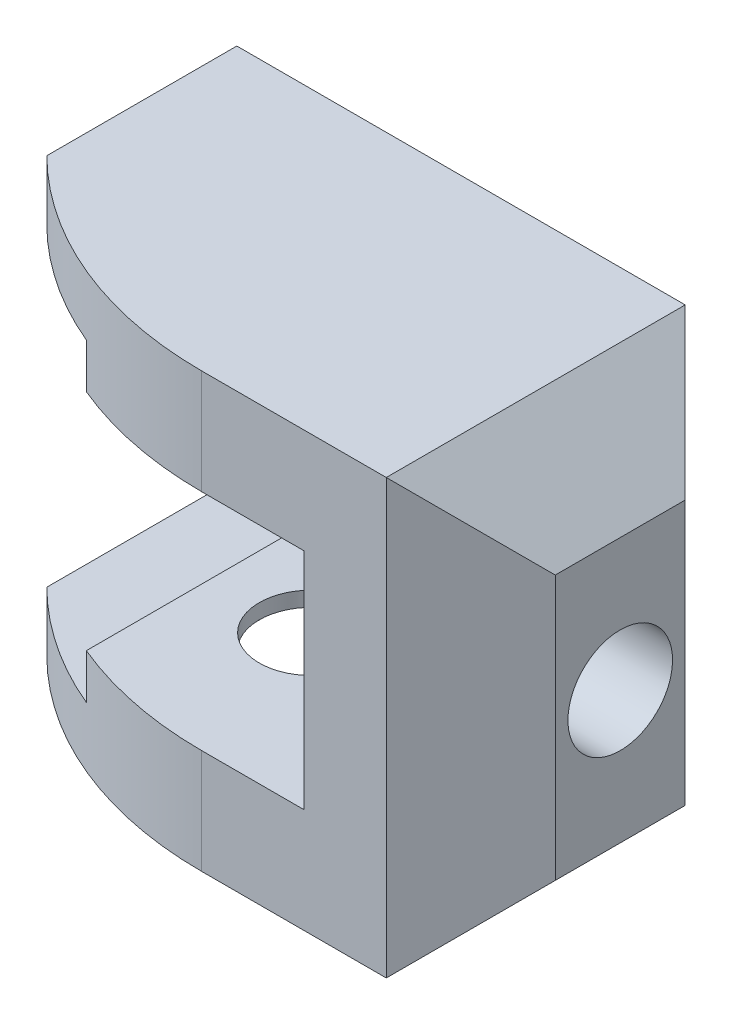
ISO-10303-21;
HEADER;
FILE_DESCRIPTION(('STEP AP214'),'2;1');
FILE_NAME('part.step','',(''),(''),'','','');
FILE_SCHEMA(('AUTOMOTIVE_DESIGN { 1 0 10303 214 1 1 1 1 }'));
ENDSEC;
DATA;
#1=APPLICATION_CONTEXT('core data for automotive mechanical design processes');
#2=APPLICATION_PROTOCOL_DEFINITION('international standard','automotive_design',2000,#1);
#3=PRODUCT_CONTEXT('',#1,'mechanical');
#4=PRODUCT('Part','Part','',(#3));
#5=PRODUCT_RELATED_PRODUCT_CATEGORY('part','',(#4));
#6=PRODUCT_DEFINITION_FORMATION('','',#4);
#7=PRODUCT_DEFINITION_CONTEXT('part definition',#1,'design');
#8=PRODUCT_DEFINITION('design','',#6,#7);
#9=PRODUCT_DEFINITION_SHAPE('','',#8);
#10=(LENGTH_UNIT() NAMED_UNIT(*) SI_UNIT(.MILLI.,.METRE.));
#11=(NAMED_UNIT(*) PLANE_ANGLE_UNIT() SI_UNIT($,.RADIAN.));
#12=(NAMED_UNIT(*) SI_UNIT($,.STERADIAN.) SOLID_ANGLE_UNIT());
#13=UNCERTAINTY_MEASURE_WITH_UNIT(LENGTH_MEASURE(1.E-05),#10,'distance_accuracy_value','');
#14=(GEOMETRIC_REPRESENTATION_CONTEXT(3) GLOBAL_UNCERTAINTY_ASSIGNED_CONTEXT((#13)) GLOBAL_UNIT_ASSIGNED_CONTEXT((#10,
#11,#12)) REPRESENTATION_CONTEXT('',''));
#15=CARTESIAN_POINT('',(0.,0.,0.));
#16=DIRECTION('',(0.,0.,1.));
#17=DIRECTION('',(1.,0.,0.));
#18=AXIS2_PLACEMENT_3D('',#15,#16,#17);
#19=CARTESIAN_POINT('',(29.,58.001,19.));
#20=DIRECTION('',(0.,-1.,0.));
#21=DIRECTION('',(0.,0.,-1.));
#22=AXIS2_PLACEMENT_3D('',#19,#20,#21);
#23=CYLINDRICAL_SURFACE('',#22,7.);
#24=CARTESIAN_POINT('',(29.,14.,19.));
#25=DIRECTION('',(0.,-1.,0.));
#26=DIRECTION('',(1.,0.,0.));
#27=AXIS2_PLACEMENT_3D('',#24,#25,#26);
#28=CIRCLE('',#27,7.);
#29=CARTESIAN_POINT('',(36.,14.,19.));
#30=VERTEX_POINT('',#29);
#31=EDGE_CURVE('E292',#30,#30,#28,.F.);
#32=ORIENTED_EDGE('',*,*,#31,.T.);
#33=EDGE_LOOP('',(#32));
#34=FACE_BOUND('',#33,.T.);
#35=CARTESIAN_POINT('',(29.,12.,19.));
#36=DIRECTION('',(0.,-1.,0.));
#37=DIRECTION('',(0.,0.,-1.));
#38=AXIS2_PLACEMENT_3D('',#35,#36,#37);
#39=CIRCLE('',#38,7.);
#40=CARTESIAN_POINT('',(29.,12.,12.));
#41=VERTEX_POINT('',#40);
#42=EDGE_CURVE('E49',#41,#41,#39,.F.);
#43=ORIENTED_EDGE('',*,*,#42,.F.);
#44=EDGE_LOOP('',(#43));
#45=FACE_BOUND('',#44,.T.);
#46=ADVANCED_FACE('F45',(#34,#45),#23,.F.);
#47=CARTESIAN_POINT('',(35.2836459108254,6.,-10.));
#48=DIRECTION('',(0.,-1.,0.));
#49=DIRECTION('',(0.,0.,-1.));
#50=AXIS2_PLACEMENT_3D('',#47,#48,#49);
#51=PLANE('',#50);
#52=DIRECTION('',(0.,0.,-1.));
#53=VECTOR('',#52,1.);
#54=CARTESIAN_POINT('',(16.0232836718898,6.,2.));
#55=LINE('',#54,#53);
#56=CARTESIAN_POINT('',(16.0232836718898,6.,33.9663331018744));
#57=VERTEX_POINT('',#56);
#58=CARTESIAN_POINT('',(16.0232836718898,6.,2.));
#59=VERTEX_POINT('',#58);
#60=EDGE_CURVE('E62',#57,#59,#55,.T.);
#61=ORIENTED_EDGE('',*,*,#60,.F.);
#62=CARTESIAN_POINT('',(35.2836459108254,6.,-10.));
#63=DIRECTION('',(0.,-1.,0.));
#64=DIRECTION('',(0.,0.,-1.));
#65=AXIS2_PLACEMENT_3D('',#62,#63,#64);
#66=CIRCLE('',#65,48.);
#67=CARTESIAN_POINT('',(0.,6.,22.5432686010409));
#68=VERTEX_POINT('',#67);
#69=EDGE_CURVE('E261',#57,#68,#66,.T.);
#70=ORIENTED_EDGE('',*,*,#69,.T.);
#71=DIRECTION('',(0.,0.,-1.));
#72=VECTOR('',#71,1.);
#73=CARTESIAN_POINT('',(0.,6.,22.5432686010409));
#74=LINE('',#73,#72);
#75=CARTESIAN_POINT('',(0.,6.,2.));
#76=VERTEX_POINT('',#75);
#77=EDGE_CURVE('E260',#68,#76,#74,.T.);
#78=ORIENTED_EDGE('',*,*,#77,.T.);
#79=DIRECTION('',(1.,0.,0.));
#80=VECTOR('',#79,1.);
#81=CARTESIAN_POINT('',(0.,6.,2.));
#82=LINE('',#81,#80);
#83=EDGE_CURVE('E264',#76,#59,#82,.T.);
#84=ORIENTED_EDGE('',*,*,#83,.T.);
#85=EDGE_LOOP('',(#61,#70,#78,#84));
#86=FACE_BOUND('',#85,.T.);
#87=ADVANCED_FACE('F453',(#86),#51,.T.);
#88=CARTESIAN_POINT('',(71.3057054763988,11.3057054763986,40.));
#89=DIRECTION('',(-0.707106781186544,0.707106781186551,0.));
#90=DIRECTION('',(-0.707106781186551,-0.707106781186544,0.));
#91=AXIS2_PLACEMENT_3D('',#88,#89,#90);
#92=PLANE('',#91);
#93=DIRECTION('',(-0.577350269189633,-0.577350269189627,-0.577350269189618));
#94=VECTOR('',#93,1.);
#95=CARTESIAN_POINT('',(80.8704703175993,20.870470317599,20.8704703175987));
#96=LINE('',#95,#94);
#97=CARTESIAN_POINT('',(71.3057054763988,11.3057054763987,11.3057054763985));
#98=VERTEX_POINT('',#97);
#99=CARTESIAN_POINT('',(60.,0.,0.));
#100=VERTEX_POINT('',#99);
#101=EDGE_CURVE('E313',#98,#100,#96,.T.);
#102=ORIENTED_EDGE('',*,*,#101,.F.);
#103=DIRECTION('',(0.,0.,-1.));
#104=VECTOR('',#103,1.);
#105=CARTESIAN_POINT('',(71.3057054763988,11.3057054763986,40.));
#106=LINE('',#105,#104);
#107=CARTESIAN_POINT('',(71.3057054763988,11.3057054763987,28.694294523601));
#108=VERTEX_POINT('',#107);
#109=EDGE_CURVE('E418',#108,#98,#106,.T.);
#110=ORIENTED_EDGE('',*,*,#109,.F.);
#111=DIRECTION('',(0.577350269189623,0.577350269189617,-0.577350269189638));
#112=VECTOR('',#111,1.);
#113=CARTESIAN_POINT('',(67.5371369842657,7.53713698426561,32.4628630157341));
#114=LINE('',#113,#112);
#115=CARTESIAN_POINT('',(60.,0.,40.));
#116=VERTEX_POINT('',#115);
#117=EDGE_CURVE('E317',#116,#108,#114,.T.);
#118=ORIENTED_EDGE('',*,*,#117,.F.);
#119=DIRECTION('',(0.,0.,-1.));
#120=VECTOR('',#119,1.);
#121=CARTESIAN_POINT('',(60.,0.,40.));
#122=LINE('',#121,#120);
#123=EDGE_CURVE('E421',#116,#100,#122,.T.);
#124=ORIENTED_EDGE('',*,*,#123,.T.);
#125=EDGE_LOOP('',(#102,#110,#118,#124));
#126=FACE_BOUND('',#125,.T.);
#127=ADVANCED_FACE('F460',(#126),#92,.F.);
#128=CARTESIAN_POINT('',(71.3057054763988,46.6942945236012,40.));
#129=DIRECTION('',(-1.,0.,0.));
#130=DIRECTION('',(0.,-1.,0.));
#131=AXIS2_PLACEMENT_3D('',#128,#129,#130);
#132=PLANE('',#131);
#133=CARTESIAN_POINT('',(71.3057054763988,28.9999999999999,19.9999999999997));
#134=DIRECTION('',(1.,0.,0.));
#135=DIRECTION('',(0.,1.,0.));
#136=AXIS2_PLACEMENT_3D('',#133,#134,#135);
#137=CIRCLE('',#136,7.);
#138=CARTESIAN_POINT('',(71.3057054763988,35.9999999999999,19.9999999999997));
#139=VERTEX_POINT('',#138);
#140=EDGE_CURVE('E297',#139,#139,#137,.T.);
#141=ORIENTED_EDGE('',*,*,#140,.F.);
#142=EDGE_LOOP('',(#141));
#143=FACE_BOUND('',#142,.T.);
#144=DIRECTION('',(0.,-1.,0.));
#145=VECTOR('',#144,1.);
#146=CARTESIAN_POINT('',(71.3057054763988,58.,11.3057054763985));
#147=LINE('',#146,#145);
#148=CARTESIAN_POINT('',(71.3057054763988,46.6942945236012,11.3057054763985));
#149=VERTEX_POINT('',#148);
#150=EDGE_CURVE('E301',#149,#98,#147,.T.);
#151=ORIENTED_EDGE('',*,*,#150,.F.);
#152=DIRECTION('',(0.,0.,-1.));
#153=VECTOR('',#152,1.);
#154=CARTESIAN_POINT('',(71.3057054763988,46.6942945236012,40.));
#155=LINE('',#154,#153);
#156=CARTESIAN_POINT('',(71.3057054763988,46.6942945236012,28.694294523601));
#157=VERTEX_POINT('',#156);
#158=EDGE_CURVE('E415',#157,#149,#155,.T.);
#159=ORIENTED_EDGE('',*,*,#158,.F.);
#160=DIRECTION('',(0.,-1.,0.));
#161=VECTOR('',#160,1.);
#162=CARTESIAN_POINT('',(71.3057054763988,58.,28.694294523601));
#163=LINE('',#162,#161);
#164=EDGE_CURVE('E308',#157,#108,#163,.T.);
#165=ORIENTED_EDGE('',*,*,#164,.T.);
#166=ORIENTED_EDGE('',*,*,#109,.T.);
#167=EDGE_LOOP('',(#151,#159,#165,#166));
#168=FACE_BOUND('',#167,.T.);
#169=ADVANCED_FACE('F545',(#143,#168),#132,.F.);
#170=CARTESIAN_POINT('',(60.,58.,40.));
#171=DIRECTION('',(-0.707106781186549,-0.707106781186546,0.));
#172=DIRECTION('',(0.707106781186546,-0.707106781186549,0.));
#173=AXIS2_PLACEMENT_3D('',#170,#171,#172);
#174=PLANE('',#173);
#175=DIRECTION('',(0.57735026918963,-0.577350269189632,0.577350269189615));
#176=VECTOR('',#175,1.);
#177=CARTESIAN_POINT('',(73.3333333333332,44.6666666666668,13.3333333333328));
#178=LINE('',#177,#176);
#179=CARTESIAN_POINT('',(60.,58.,0.));
#180=VERTEX_POINT('',#179);
#181=EDGE_CURVE('E307',#180,#149,#178,.T.);
#182=ORIENTED_EDGE('',*,*,#181,.F.);
#183=DIRECTION('',(0.,0.,-1.));
#184=VECTOR('',#183,1.);
#185=CARTESIAN_POINT('',(60.,58.,40.));
#186=LINE('',#185,#184);
#187=CARTESIAN_POINT('',(60.,58.,40.));
#188=VERTEX_POINT('',#187);
#189=EDGE_CURVE('E412',#188,#180,#186,.T.);
#190=ORIENTED_EDGE('',*,*,#189,.F.);
#191=DIRECTION('',(-0.57735026918962,0.577350269189622,0.577350269189635));
#192=VECTOR('',#191,1.);
#193=CARTESIAN_POINT('',(60.,58.,40.));
#194=LINE('',#193,#192);
#195=EDGE_CURVE('E315',#157,#188,#194,.T.);
#196=ORIENTED_EDGE('',*,*,#195,.F.);
#197=ORIENTED_EDGE('',*,*,#158,.T.);
#198=EDGE_LOOP('',(#182,#190,#196,#197));
#199=FACE_BOUND('',#198,.T.);
#200=ADVANCED_FACE('F528',(#199),#174,.F.);
#201=CARTESIAN_POINT('',(0.,0.,40.));
#202=DIRECTION('',(0.,0.,1.));
#203=DIRECTION('',(1.,0.,0.));
#204=AXIS2_PLACEMENT_3D('',#201,#202,#203);
#205=PLANE('',#204);
#206=DIRECTION('',(1.,0.,0.));
#207=VECTOR('',#206,1.);
#208=CARTESIAN_POINT('',(0.,0.,40.));
#209=LINE('',#208,#207);
#210=CARTESIAN_POINT('',(35.2836459108254,0.,40.));
#211=VERTEX_POINT('',#210);
#212=EDGE_CURVE('E349',#211,#116,#209,.T.);
#213=ORIENTED_EDGE('',*,*,#212,.T.);
#214=DIRECTION('',(0.,-1.,0.));
#215=VECTOR('',#214,1.);
#216=CARTESIAN_POINT('',(60.,58.,40.));
#217=LINE('',#216,#215);
#218=EDGE_CURVE('E304',#188,#116,#217,.T.);
#219=ORIENTED_EDGE('',*,*,#218,.F.);
#220=DIRECTION('',(-1.,0.,0.));
#221=VECTOR('',#220,1.);
#222=CARTESIAN_POINT('',(0.,58.,40.));
#223=LINE('',#222,#221);
#224=CARTESIAN_POINT('',(35.2836459108254,58.,40.));
#225=VERTEX_POINT('',#224);
#226=EDGE_CURVE('E352',#188,#225,#223,.T.);
#227=ORIENTED_EDGE('',*,*,#226,.T.);
#228=DIRECTION('',(0.,-1.,0.));
#229=VECTOR('',#228,1.);
#230=CARTESIAN_POINT('',(35.2836459108254,58.,40.));
#231=LINE('',#230,#229);
#232=CARTESIAN_POINT('',(35.2836459108254,44.,40.));
#233=VERTEX_POINT('',#232);
#234=EDGE_CURVE('E323',#225,#233,#231,.T.);
#235=ORIENTED_EDGE('',*,*,#234,.T.);
#236=DIRECTION('',(1.,0.,0.));
#237=VECTOR('',#236,1.);
#238=CARTESIAN_POINT('',(16.,44.,40.));
#239=LINE('',#238,#237);
#240=CARTESIAN_POINT('',(49.,44.,40.));
#241=VERTEX_POINT('',#240);
#242=EDGE_CURVE('E356',#233,#241,#239,.T.);
#243=ORIENTED_EDGE('',*,*,#242,.T.);
#244=DIRECTION('',(0.,-1.,0.));
#245=VECTOR('',#244,1.);
#246=CARTESIAN_POINT('',(49.,44.,40.));
#247=LINE('',#246,#245);
#248=CARTESIAN_POINT('',(49.,14.,40.));
#249=VERTEX_POINT('',#248);
#250=EDGE_CURVE('E358',#241,#249,#247,.T.);
#251=ORIENTED_EDGE('',*,*,#250,.T.);
#252=DIRECTION('',(-1.,0.,0.));
#253=VECTOR('',#252,1.);
#254=CARTESIAN_POINT('',(49.,14.,40.));
#255=LINE('',#254,#253);
#256=CARTESIAN_POINT('',(35.2836459108254,14.,40.));
#257=VERTEX_POINT('',#256);
#258=EDGE_CURVE('E360',#249,#257,#255,.T.);
#259=ORIENTED_EDGE('',*,*,#258,.T.);
#260=DIRECTION('',(0.,-1.,0.));
#261=VECTOR('',#260,1.);
#262=CARTESIAN_POINT('',(35.2836459108254,58.,40.));
#263=LINE('',#262,#261);
#264=EDGE_CURVE('E11',#211,#257,#263,.F.);
#265=ORIENTED_EDGE('',*,*,#264,.F.);
#266=EDGE_LOOP('',(#213,#219,#227,#235,#243,#251,#259,#265));
#267=FACE_BOUND('',#266,.T.);
#268=ADVANCED_FACE('F537',(#267),#205,.T.);
#269=CARTESIAN_POINT('',(0.,0.,0.));
#270=DIRECTION('',(0.,0.,1.));
#271=DIRECTION('',(1.,0.,0.));
#272=AXIS2_PLACEMENT_3D('',#269,#270,#271);
#273=PLANE('',#272);
#274=DIRECTION('',(0.,-1.,0.));
#275=VECTOR('',#274,1.);
#276=CARTESIAN_POINT('',(60.,58.,0.));
#277=LINE('',#276,#275);
#278=EDGE_CURVE('E303',#180,#100,#277,.T.);
#279=ORIENTED_EDGE('',*,*,#278,.T.);
#280=DIRECTION('',(1.,0.,0.));
#281=VECTOR('',#280,1.);
#282=CARTESIAN_POINT('',(0.,0.,0.));
#283=LINE('',#282,#281);
#284=CARTESIAN_POINT('',(0.,0.,0.));
#285=VERTEX_POINT('',#284);
#286=EDGE_CURVE('E366',#285,#100,#283,.T.);
#287=ORIENTED_EDGE('',*,*,#286,.F.);
#288=DIRECTION('',(0.,-1.,0.));
#289=VECTOR('',#288,1.);
#290=CARTESIAN_POINT('',(0.,8.,0.));
#291=LINE('',#290,#289);
#292=CARTESIAN_POINT('',(0.,8.,0.));
#293=VERTEX_POINT('',#292);
#294=EDGE_CURVE('E348',#293,#285,#291,.T.);
#295=ORIENTED_EDGE('',*,*,#294,.F.);
#296=DIRECTION('',(-1.,0.,0.));
#297=VECTOR('',#296,1.);
#298=CARTESIAN_POINT('',(16.,8.,0.));
#299=LINE('',#298,#297);
#300=CARTESIAN_POINT('',(16.,8.,0.));
#301=VERTEX_POINT('',#300);
#302=EDGE_CURVE('E353',#301,#293,#299,.T.);
#303=ORIENTED_EDGE('',*,*,#302,.F.);
#304=DIRECTION('',(0.,-1.,0.));
#305=VECTOR('',#304,1.);
#306=CARTESIAN_POINT('',(16.,14.,0.));
#307=LINE('',#306,#305);
#308=CARTESIAN_POINT('',(16.,14.,0.));
#309=VERTEX_POINT('',#308);
#310=EDGE_CURVE('E388',#309,#301,#307,.T.);
#311=ORIENTED_EDGE('',*,*,#310,.F.);
#312=DIRECTION('',(-1.,0.,0.));
#313=VECTOR('',#312,1.);
#314=CARTESIAN_POINT('',(49.,14.,0.));
#315=LINE('',#314,#313);
#316=CARTESIAN_POINT('',(49.,14.,0.));
#317=VERTEX_POINT('',#316);
#318=EDGE_CURVE('E385',#317,#309,#315,.T.);
#319=ORIENTED_EDGE('',*,*,#318,.F.);
#320=DIRECTION('',(0.,-1.,0.));
#321=VECTOR('',#320,1.);
#322=CARTESIAN_POINT('',(49.,44.,0.));
#323=LINE('',#322,#321);
#324=CARTESIAN_POINT('',(49.,44.,0.));
#325=VERTEX_POINT('',#324);
#326=EDGE_CURVE('E383',#325,#317,#323,.T.);
#327=ORIENTED_EDGE('',*,*,#326,.F.);
#328=DIRECTION('',(1.,0.,0.));
#329=VECTOR('',#328,1.);
#330=CARTESIAN_POINT('',(45.9742381767017,44.,0.));
#331=LINE('',#330,#329);
#332=CARTESIAN_POINT('',(16.,44.,0.));
#333=VERTEX_POINT('',#332);
#334=EDGE_CURVE('E381',#333,#325,#331,.T.);
#335=ORIENTED_EDGE('',*,*,#334,.F.);
#336=DIRECTION('',(0.,-1.,0.));
#337=VECTOR('',#336,1.);
#338=CARTESIAN_POINT('',(16.,50.,0.));
#339=LINE('',#338,#337);
#340=CARTESIAN_POINT('',(16.,50.,0.));
#341=VERTEX_POINT('',#340);
#342=EDGE_CURVE('E378',#341,#333,#339,.T.);
#343=ORIENTED_EDGE('',*,*,#342,.F.);
#344=DIRECTION('',(1.,0.,0.));
#345=VECTOR('',#344,1.);
#346=CARTESIAN_POINT('',(0.,50.,0.));
#347=LINE('',#346,#345);
#348=CARTESIAN_POINT('',(0.,50.,0.));
#349=VERTEX_POINT('',#348);
#350=EDGE_CURVE('E375',#349,#341,#347,.T.);
#351=ORIENTED_EDGE('',*,*,#350,.F.);
#352=DIRECTION('',(0.,-1.,0.));
#353=VECTOR('',#352,1.);
#354=CARTESIAN_POINT('',(0.,58.,0.));
#355=LINE('',#354,#353);
#356=CARTESIAN_POINT('',(0.,58.,0.));
#357=VERTEX_POINT('',#356);
#358=EDGE_CURVE('E372',#357,#349,#355,.T.);
#359=ORIENTED_EDGE('',*,*,#358,.F.);
#360=DIRECTION('',(-1.,0.,0.));
#361=VECTOR('',#360,1.);
#362=CARTESIAN_POINT('',(0.,58.,0.));
#363=LINE('',#362,#361);
#364=EDGE_CURVE('E369',#180,#357,#363,.T.);
#365=ORIENTED_EDGE('',*,*,#364,.F.);
#366=EDGE_LOOP('',(#279,#287,#295,#303,#311,#319,#327,#335,#343,#351,#359,#365));
#367=FACE_BOUND('',#366,.T.);
#368=ADVANCED_FACE('F518',(#367),#273,.F.);
#369=CARTESIAN_POINT('',(0.,8.,40.));
#370=DIRECTION('',(1.,0.,0.));
#371=DIRECTION('',(0.,1.,0.));
#372=AXIS2_PLACEMENT_3D('',#369,#370,#371);
#373=PLANE('',#372);
#374=ORIENTED_EDGE('',*,*,#77,.F.);
#375=DIRECTION('',(0.,-1.,0.));
#376=VECTOR('',#375,1.);
#377=CARTESIAN_POINT('',(0.,6.,22.5432686010409));
#378=LINE('',#377,#376);
#379=CARTESIAN_POINT('',(0.,0.,22.5432686010409));
#380=VERTEX_POINT('',#379);
#381=EDGE_CURVE('E270',#68,#380,#378,.T.);
#382=ORIENTED_EDGE('',*,*,#381,.T.);
#383=DIRECTION('',(0.,0.,-1.));
#384=VECTOR('',#383,1.);
#385=CARTESIAN_POINT('',(0.,0.,40.));
#386=LINE('',#385,#384);
#387=CARTESIAN_POINT('',(0.,0.,25.4268871231935));
#388=VERTEX_POINT('',#387);
#389=EDGE_CURVE('E54',#388,#380,#386,.T.);
#390=ORIENTED_EDGE('',*,*,#389,.F.);
#391=DIRECTION('',(0.,-1.,0.));
#392=VECTOR('',#391,1.);
#393=CARTESIAN_POINT('',(0.,58.,25.4268871231935));
#394=LINE('',#393,#392);
#395=CARTESIAN_POINT('',(0.,8.00000000000001,25.4268871231935));
#396=VERTEX_POINT('',#395);
#397=EDGE_CURVE('E328',#396,#388,#394,.T.);
#398=ORIENTED_EDGE('',*,*,#397,.F.);
#399=DIRECTION('',(0.,0.,-1.));
#400=VECTOR('',#399,1.);
#401=CARTESIAN_POINT('',(0.,8.,40.));
#402=LINE('',#401,#400);
#403=EDGE_CURVE('E363',#396,#293,#402,.T.);
#404=ORIENTED_EDGE('',*,*,#403,.T.);
#405=ORIENTED_EDGE('',*,*,#294,.T.);
#406=CARTESIAN_POINT('',(0.,0.,2.));
#407=VERTEX_POINT('',#406);
#408=EDGE_CURVE('E424',#407,#285,#386,.T.);
#409=ORIENTED_EDGE('',*,*,#408,.F.);
#410=DIRECTION('',(0.,-1.,0.));
#411=VECTOR('',#410,1.);
#412=CARTESIAN_POINT('',(0.,6.,2.));
#413=LINE('',#412,#411);
#414=EDGE_CURVE('E70',#76,#407,#413,.T.);
#415=ORIENTED_EDGE('',*,*,#414,.F.);
#416=EDGE_LOOP('',(#374,#382,#390,#398,#404,#405,#409,#415));
#417=FACE_BOUND('',#416,.T.);
#418=ADVANCED_FACE('F47',(#417),#373,.F.);
#419=CARTESIAN_POINT('',(0.,0.,40.));
#420=DIRECTION('',(0.,1.,0.));
#421=DIRECTION('',(0.,0.,1.));
#422=AXIS2_PLACEMENT_3D('',#419,#420,#421);
#423=PLANE('',#422);
#424=ORIENTED_EDGE('',*,*,#389,.T.);
#425=CARTESIAN_POINT('',(35.2836459108254,0.,-10.));
#426=DIRECTION('',(0.,-1.,0.));
#427=DIRECTION('',(0.,0.,-1.));
#428=AXIS2_PLACEMENT_3D('',#425,#426,#427);
#429=CIRCLE('',#428,48.);
#430=CARTESIAN_POINT('',(35.2836459108254,0.,38.));
#431=VERTEX_POINT('',#430);
#432=EDGE_CURVE('E271',#431,#380,#429,.T.);
#433=ORIENTED_EDGE('',*,*,#432,.F.);
#434=DIRECTION('',(-1.,0.,0.));
#435=VECTOR('',#434,1.);
#436=CARTESIAN_POINT('',(58.,0.,38.));
#437=LINE('',#436,#435);
#438=CARTESIAN_POINT('',(58.,0.,38.));
#439=VERTEX_POINT('',#438);
#440=EDGE_CURVE('E277',#439,#431,#437,.T.);
#441=ORIENTED_EDGE('',*,*,#440,.F.);
#442=DIRECTION('',(0.,0.,1.));
#443=VECTOR('',#442,1.);
#444=CARTESIAN_POINT('',(58.,0.,2.));
#445=LINE('',#444,#443);
#446=CARTESIAN_POINT('',(58.,0.,2.));
#447=VERTEX_POINT('',#446);
#448=EDGE_CURVE('E275',#447,#439,#445,.T.);
#449=ORIENTED_EDGE('',*,*,#448,.F.);
#450=DIRECTION('',(1.,0.,0.));
#451=VECTOR('',#450,1.);
#452=CARTESIAN_POINT('',(0.,0.,2.));
#453=LINE('',#452,#451);
#454=EDGE_CURVE('E273',#407,#447,#453,.T.);
#455=ORIENTED_EDGE('',*,*,#454,.F.);
#456=ORIENTED_EDGE('',*,*,#408,.T.);
#457=ORIENTED_EDGE('',*,*,#286,.T.);
#458=ORIENTED_EDGE('',*,*,#123,.F.);
#459=ORIENTED_EDGE('',*,*,#212,.F.);
#460=CARTESIAN_POINT('',(35.2836459108254,0.,-10.));
#461=DIRECTION('',(0.,1.,0.));
#462=DIRECTION('',(0.,0.,1.));
#463=AXIS2_PLACEMENT_3D('',#460,#461,#462);
#464=CIRCLE('',#463,50.);
#465=EDGE_CURVE('E319',#388,#211,#464,.T.);
#466=ORIENTED_EDGE('',*,*,#465,.F.);
#467=EDGE_LOOP('',(#424,#433,#441,#449,#455,#456,#457,#458,#459,#466));
#468=FACE_BOUND('',#467,.T.);
#469=ADVANCED_FACE('F514',(#468),#423,.F.);
#470=CARTESIAN_POINT('',(0.,58.,40.));
#471=DIRECTION('',(0.,-1.,0.));
#472=DIRECTION('',(0.,0.,-1.));
#473=AXIS2_PLACEMENT_3D('',#470,#471,#472);
#474=PLANE('',#473);
#475=DIRECTION('',(0.,0.,-1.));
#476=VECTOR('',#475,1.);
#477=CARTESIAN_POINT('',(0.,58.,40.));
#478=LINE('',#477,#476);
#479=CARTESIAN_POINT('',(0.,58.,25.4268871231935));
#480=VERTEX_POINT('',#479);
#481=EDGE_CURVE('E410',#480,#357,#478,.T.);
#482=ORIENTED_EDGE('',*,*,#481,.F.);
#483=CARTESIAN_POINT('',(35.2836459108254,58.,-10.));
#484=DIRECTION('',(0.,1.,0.));
#485=DIRECTION('',(0.,0.,1.));
#486=AXIS2_PLACEMENT_3D('',#483,#484,#485);
#487=CIRCLE('',#486,50.);
#488=EDGE_CURVE('E320',#480,#225,#487,.T.);
#489=ORIENTED_EDGE('',*,*,#488,.T.);
#490=ORIENTED_EDGE('',*,*,#226,.F.);
#491=ORIENTED_EDGE('',*,*,#189,.T.);
#492=ORIENTED_EDGE('',*,*,#364,.T.);
#493=EDGE_LOOP('',(#482,#489,#490,#491,#492));
#494=FACE_BOUND('',#493,.T.);
#495=ADVANCED_FACE('F534',(#494),#474,.F.);
#496=CARTESIAN_POINT('',(0.,58.,40.));
#497=DIRECTION('',(1.,0.,0.));
#498=DIRECTION('',(0.,1.,0.));
#499=AXIS2_PLACEMENT_3D('',#496,#497,#498);
#500=PLANE('',#499);
#501=DIRECTION('',(0.,0.,-1.));
#502=VECTOR('',#501,1.);
#503=CARTESIAN_POINT('',(0.,50.,40.));
#504=LINE('',#503,#502);
#505=CARTESIAN_POINT('',(0.,50.,25.4268871231935));
#506=VERTEX_POINT('',#505);
#507=EDGE_CURVE('E408',#506,#349,#504,.T.);
#508=ORIENTED_EDGE('',*,*,#507,.F.);
#509=EDGE_CURVE('E325',#480,#506,#394,.T.);
#510=ORIENTED_EDGE('',*,*,#509,.F.);
#511=ORIENTED_EDGE('',*,*,#481,.T.);
#512=ORIENTED_EDGE('',*,*,#358,.T.);
#513=EDGE_LOOP('',(#508,#510,#511,#512));
#514=FACE_BOUND('',#513,.T.);
#515=ADVANCED_FACE('F561',(#514),#500,.F.);
#516=CARTESIAN_POINT('',(0.,50.,40.));
#517=DIRECTION('',(0.,1.,0.));
#518=DIRECTION('',(-1.,0.,0.));
#519=AXIS2_PLACEMENT_3D('',#516,#517,#518);
#520=PLANE('',#519);
#521=DIRECTION('',(0.,0.,-1.));
#522=VECTOR('',#521,1.);
#523=CARTESIAN_POINT('',(16.,50.,40.));
#524=LINE('',#523,#522);
#525=CARTESIAN_POINT('',(16.,50.,36.1317786388722));
#526=VERTEX_POINT('',#525);
#527=EDGE_CURVE('E406',#526,#341,#524,.T.);
#528=ORIENTED_EDGE('',*,*,#527,.F.);
#529=CARTESIAN_POINT('',(35.2836459108254,50.,-10.));
#530=DIRECTION('',(0.,1.,0.));
#531=DIRECTION('',(-1.,0.,0.));
#532=AXIS2_PLACEMENT_3D('',#529,#530,#531);
#533=CIRCLE('',#532,50.);
#534=EDGE_CURVE('E345',#526,#506,#533,.F.);
#535=ORIENTED_EDGE('',*,*,#534,.T.);
#536=ORIENTED_EDGE('',*,*,#507,.T.);
#537=ORIENTED_EDGE('',*,*,#350,.T.);
#538=EDGE_LOOP('',(#528,#535,#536,#537));
#539=FACE_BOUND('',#538,.T.);
#540=ADVANCED_FACE('F592',(#539),#520,.F.);
#541=CARTESIAN_POINT('',(16.,50.,40.));
#542=DIRECTION('',(1.,0.,0.));
#543=DIRECTION('',(0.,1.,0.));
#544=AXIS2_PLACEMENT_3D('',#541,#542,#543);
#545=PLANE('',#544);
#546=DIRECTION('',(0.,0.,-1.));
#547=VECTOR('',#546,1.);
#548=CARTESIAN_POINT('',(16.,44.,40.));
#549=LINE('',#548,#547);
#550=CARTESIAN_POINT('',(16.,44.,36.1317786388722));
#551=VERTEX_POINT('',#550);
#552=EDGE_CURVE('E404',#551,#333,#549,.T.);
#553=ORIENTED_EDGE('',*,*,#552,.F.);
#554=DIRECTION('',(0.,-1.,0.));
#555=VECTOR('',#554,1.);
#556=CARTESIAN_POINT('',(16.,58.,36.1317786388722));
#557=LINE('',#556,#555);
#558=EDGE_CURVE('E342',#551,#526,#557,.F.);
#559=ORIENTED_EDGE('',*,*,#558,.T.);
#560=ORIENTED_EDGE('',*,*,#527,.T.);
#561=ORIENTED_EDGE('',*,*,#342,.T.);
#562=EDGE_LOOP('',(#553,#559,#560,#561));
#563=FACE_BOUND('',#562,.T.);
#564=ADVANCED_FACE('F588',(#563),#545,.F.);
#565=CARTESIAN_POINT('',(45.9742381767017,44.,40.));
#566=DIRECTION('',(0.,1.,0.));
#567=DIRECTION('',(0.,0.,1.));
#568=AXIS2_PLACEMENT_3D('',#565,#566,#567);
#569=PLANE('',#568);
#570=CARTESIAN_POINT('',(29.,44.,19.));
#571=DIRECTION('',(0.,-1.,0.));
#572=DIRECTION('',(0.,0.,-1.));
#573=AXIS2_PLACEMENT_3D('',#570,#571,#572);
#574=CIRCLE('',#573,7.);
#575=CARTESIAN_POINT('',(29.,44.,12.));
#576=VERTEX_POINT('',#575);
#577=EDGE_CURVE('E282',#576,#576,#574,.T.);
#578=ORIENTED_EDGE('',*,*,#577,.F.);
#579=EDGE_LOOP('',(#578));
#580=FACE_BOUND('',#579,.T.);
#581=ORIENTED_EDGE('',*,*,#242,.F.);
#582=CARTESIAN_POINT('',(35.2836459108254,44.,-10.));
#583=DIRECTION('',(0.,1.,0.));
#584=DIRECTION('',(0.,0.,1.));
#585=AXIS2_PLACEMENT_3D('',#582,#583,#584);
#586=CIRCLE('',#585,50.);
#587=EDGE_CURVE('E339',#233,#551,#586,.F.);
#588=ORIENTED_EDGE('',*,*,#587,.T.);
#589=ORIENTED_EDGE('',*,*,#552,.T.);
#590=ORIENTED_EDGE('',*,*,#334,.T.);
#591=DIRECTION('',(0.,0.,-1.));
#592=VECTOR('',#591,1.);
#593=CARTESIAN_POINT('',(49.,44.,40.));
#594=LINE('',#593,#592);
#595=EDGE_CURVE('E401',#241,#325,#594,.T.);
#596=ORIENTED_EDGE('',*,*,#595,.F.);
#597=EDGE_LOOP('',(#581,#588,#589,#590,#596));
#598=FACE_BOUND('',#597,.T.);
#599=ADVANCED_FACE('F585',(#580,#598),#569,.F.);
#600=CARTESIAN_POINT('',(49.,44.,40.));
#601=DIRECTION('',(1.,0.,0.));
#602=DIRECTION('',(0.,0.,-1.));
#603=AXIS2_PLACEMENT_3D('',#600,#601,#602);
#604=PLANE('',#603);
#605=CARTESIAN_POINT('',(49.,28.9999999999999,19.9999999999997));
#606=DIRECTION('',(1.,0.,0.));
#607=DIRECTION('',(0.,0.,-1.));
#608=AXIS2_PLACEMENT_3D('',#605,#606,#607);
#609=CIRCLE('',#608,7.);
#610=CARTESIAN_POINT('',(49.,28.9999999999999,12.9999999999997));
#611=VERTEX_POINT('',#610);
#612=EDGE_CURVE('E300',#611,#611,#609,.T.);
#613=ORIENTED_EDGE('',*,*,#612,.T.);
#614=EDGE_LOOP('',(#613));
#615=FACE_BOUND('',#614,.T.);
#616=ORIENTED_EDGE('',*,*,#326,.T.);
#617=DIRECTION('',(0.,0.,-1.));
#618=VECTOR('',#617,1.);
#619=CARTESIAN_POINT('',(49.,14.,40.));
#620=LINE('',#619,#618);
#621=EDGE_CURVE('E398',#249,#317,#620,.T.);
#622=ORIENTED_EDGE('',*,*,#621,.F.);
#623=ORIENTED_EDGE('',*,*,#250,.F.);
#624=ORIENTED_EDGE('',*,*,#595,.T.);
#625=EDGE_LOOP('',(#616,#622,#623,#624));
#626=FACE_BOUND('',#625,.T.);
#627=ADVANCED_FACE('F429',(#615,#626),#604,.F.);
#628=CARTESIAN_POINT('',(49.,14.,40.));
#629=DIRECTION('',(0.,-1.,0.));
#630=DIRECTION('',(1.,0.,0.));
#631=AXIS2_PLACEMENT_3D('',#628,#629,#630);
#632=PLANE('',#631);
#633=ORIENTED_EDGE('',*,*,#31,.F.);
#634=EDGE_LOOP('',(#633));
#635=FACE_BOUND('',#634,.T.);
#636=DIRECTION('',(0.,0.,-1.));
#637=VECTOR('',#636,1.);
#638=CARTESIAN_POINT('',(16.,14.,40.));
#639=LINE('',#638,#637);
#640=CARTESIAN_POINT('',(16.,14.,36.1317786388722));
#641=VERTEX_POINT('',#640);
#642=EDGE_CURVE('E396',#641,#309,#639,.T.);
#643=ORIENTED_EDGE('',*,*,#642,.F.);
#644=CARTESIAN_POINT('',(35.2836459108254,14.,-10.));
#645=DIRECTION('',(0.,-1.,0.));
#646=DIRECTION('',(1.,0.,0.));
#647=AXIS2_PLACEMENT_3D('',#644,#645,#646);
#648=CIRCLE('',#647,50.);
#649=EDGE_CURVE('E336',#641,#257,#648,.F.);
#650=ORIENTED_EDGE('',*,*,#649,.T.);
#651=ORIENTED_EDGE('',*,*,#258,.F.);
#652=ORIENTED_EDGE('',*,*,#621,.T.);
#653=ORIENTED_EDGE('',*,*,#318,.T.);
#654=EDGE_LOOP('',(#643,#650,#651,#652,#653));
#655=FACE_BOUND('',#654,.T.);
#656=ADVANCED_FACE('F580',(#635,#655),#632,.F.);
#657=CARTESIAN_POINT('',(16.,14.,40.));
#658=DIRECTION('',(1.,0.,0.));
#659=DIRECTION('',(0.,0.,-1.));
#660=AXIS2_PLACEMENT_3D('',#657,#658,#659);
#661=PLANE('',#660);
#662=DIRECTION('',(0.,0.,-1.));
#663=VECTOR('',#662,1.);
#664=CARTESIAN_POINT('',(16.,8.,40.));
#665=LINE('',#664,#663);
#666=CARTESIAN_POINT('',(16.,8.,36.1317786388722));
#667=VERTEX_POINT('',#666);
#668=EDGE_CURVE('E394',#667,#301,#665,.T.);
#669=ORIENTED_EDGE('',*,*,#668,.F.);
#670=DIRECTION('',(0.,-1.,0.));
#671=VECTOR('',#670,1.);
#672=CARTESIAN_POINT('',(16.,58.,36.1317786388722));
#673=LINE('',#672,#671);
#674=EDGE_CURVE('E333',#667,#641,#673,.F.);
#675=ORIENTED_EDGE('',*,*,#674,.T.);
#676=ORIENTED_EDGE('',*,*,#642,.T.);
#677=ORIENTED_EDGE('',*,*,#310,.T.);
#678=EDGE_LOOP('',(#669,#675,#676,#677));
#679=FACE_BOUND('',#678,.T.);
#680=ADVANCED_FACE('F576',(#679),#661,.F.);
#681=CARTESIAN_POINT('',(16.,8.,40.));
#682=DIRECTION('',(0.,-1.,0.));
#683=DIRECTION('',(1.,0.,0.));
#684=AXIS2_PLACEMENT_3D('',#681,#682,#683);
#685=PLANE('',#684);
#686=ORIENTED_EDGE('',*,*,#403,.F.);
#687=CARTESIAN_POINT('',(35.2836459108254,8.,-10.));
#688=DIRECTION('',(0.,-1.,0.));
#689=DIRECTION('',(1.,0.,0.));
#690=AXIS2_PLACEMENT_3D('',#687,#688,#689);
#691=CIRCLE('',#690,50.);
#692=EDGE_CURVE('E327',#396,#667,#691,.F.);
#693=ORIENTED_EDGE('',*,*,#692,.T.);
#694=ORIENTED_EDGE('',*,*,#668,.T.);
#695=ORIENTED_EDGE('',*,*,#302,.T.);
#696=EDGE_LOOP('',(#686,#693,#694,#695));
#697=FACE_BOUND('',#696,.T.);
#698=ADVANCED_FACE('F572',(#697),#685,.F.);
#699=CARTESIAN_POINT('',(35.2836459108254,58.,-10.));
#700=DIRECTION('',(0.,-1.,0.));
#701=DIRECTION('',(0.,0.,-1.));
#702=AXIS2_PLACEMENT_3D('',#699,#700,#701);
#703=CYLINDRICAL_SURFACE('',#702,50.);
#704=ORIENTED_EDGE('',*,*,#558,.F.);
#705=ORIENTED_EDGE('',*,*,#587,.F.);
#706=ORIENTED_EDGE('',*,*,#234,.F.);
#707=ORIENTED_EDGE('',*,*,#488,.F.);
#708=ORIENTED_EDGE('',*,*,#509,.T.);
#709=ORIENTED_EDGE('',*,*,#534,.F.);
#710=EDGE_LOOP('',(#704,#705,#706,#707,#708,#709));
#711=FACE_BOUND('',#710,.T.);
#712=ADVANCED_FACE('F575',(#711),#703,.T.);
#713=ORIENTED_EDGE('',*,*,#674,.F.);
#714=ORIENTED_EDGE('',*,*,#692,.F.);
#715=ORIENTED_EDGE('',*,*,#397,.T.);
#716=ORIENTED_EDGE('',*,*,#465,.T.);
#717=ORIENTED_EDGE('',*,*,#264,.T.);
#718=ORIENTED_EDGE('',*,*,#649,.F.);
#719=EDGE_LOOP('',(#713,#714,#715,#716,#717,#718));
#720=FACE_BOUND('',#719,.T.);
#721=ADVANCED_FACE('F624',(#720),#703,.T.);
#722=CARTESIAN_POINT('',(60.,58.,0.));
#723=DIRECTION('',(0.707106781186538,0.,-0.707106781186557));
#724=DIRECTION('',(-0.707106781186557,0.,-0.707106781186538));
#725=AXIS2_PLACEMENT_3D('',#722,#723,#724);
#726=PLANE('',#725);
#727=ORIENTED_EDGE('',*,*,#101,.T.);
#728=ORIENTED_EDGE('',*,*,#278,.F.);
#729=ORIENTED_EDGE('',*,*,#181,.T.);
#730=ORIENTED_EDGE('',*,*,#150,.T.);
#731=EDGE_LOOP('',(#727,#728,#729,#730));
#732=FACE_BOUND('',#731,.T.);
#733=ADVANCED_FACE('F447',(#732),#726,.T.);
#734=CARTESIAN_POINT('',(60.,58.,40.));
#735=DIRECTION('',(0.707106781186557,0.,0.707106781186538));
#736=DIRECTION('',(0.707106781186538,0.,-0.707106781186557));
#737=AXIS2_PLACEMENT_3D('',#734,#735,#736);
#738=PLANE('',#737);
#739=ORIENTED_EDGE('',*,*,#117,.T.);
#740=ORIENTED_EDGE('',*,*,#164,.F.);
#741=ORIENTED_EDGE('',*,*,#195,.T.);
#742=ORIENTED_EDGE('',*,*,#218,.T.);
#743=EDGE_LOOP('',(#739,#740,#741,#742));
#744=FACE_BOUND('',#743,.T.);
#745=ADVANCED_FACE('F435',(#744),#738,.T.);
#746=CARTESIAN_POINT('',(0.,28.9999999999999,19.9999999999997));
#747=DIRECTION('',(1.,0.,0.));
#748=DIRECTION('',(0.,1.,0.));
#749=AXIS2_PLACEMENT_3D('',#746,#747,#748);
#750=CYLINDRICAL_SURFACE('',#749,7.);
#751=ORIENTED_EDGE('',*,*,#140,.T.);
#752=EDGE_LOOP('',(#751));
#753=FACE_BOUND('',#752,.T.);
#754=ORIENTED_EDGE('',*,*,#612,.F.);
#755=EDGE_LOOP('',(#754));
#756=FACE_BOUND('',#755,.T.);
#757=ADVANCED_FACE('F432',(#753,#756),#750,.F.);
#758=CARTESIAN_POINT('',(29.,46.,19.));
#759=DIRECTION('',(0.,-1.,0.));
#760=DIRECTION('',(0.,0.,-1.));
#761=AXIS2_PLACEMENT_3D('',#758,#759,#760);
#762=CYLINDRICAL_SURFACE('',#761,7.);
#763=CARTESIAN_POINT('',(29.,46.,19.));
#764=DIRECTION('',(0.,-1.,0.));
#765=DIRECTION('',(0.,0.,-1.));
#766=AXIS2_PLACEMENT_3D('',#763,#764,#765);
#767=CIRCLE('',#766,7.);
#768=CARTESIAN_POINT('',(29.,46.,12.));
#769=VERTEX_POINT('',#768);
#770=EDGE_CURVE('E289',#769,#769,#767,.T.);
#771=ORIENTED_EDGE('',*,*,#770,.F.);
#772=EDGE_LOOP('',(#771));
#773=FACE_BOUND('',#772,.T.);
#774=ORIENTED_EDGE('',*,*,#577,.T.);
#775=EDGE_LOOP('',(#774));
#776=FACE_BOUND('',#775,.T.);
#777=ADVANCED_FACE('F434',(#773,#776),#762,.F.);
#778=CARTESIAN_POINT('',(29.,46.,19.));
#779=DIRECTION('',(0.,-1.,0.));
#780=DIRECTION('',(0.,0.,-1.));
#781=AXIS2_PLACEMENT_3D('',#778,#779,#780);
#782=PLANE('',#781);
#783=ORIENTED_EDGE('',*,*,#770,.T.);
#784=EDGE_LOOP('',(#783));
#785=FACE_BOUND('',#784,.T.);
#786=ADVANCED_FACE('F443',(#785),#782,.T.);
#787=DIRECTION('',(-0.999999768183722,0.,-0.000680905648630459));
#788=VECTOR('',#787,1.);
#789=CARTESIAN_POINT('',(58.,6.,38.));
#790=LINE('',#789,#788);
#791=CARTESIAN_POINT('',(58.,6.,38.));
#792=VERTEX_POINT('',#791);
#793=CARTESIAN_POINT('',(34.0320691549732,6.,37.9836800967184));
#794=VERTEX_POINT('',#793);
#795=EDGE_CURVE('E240',#792,#794,#790,.T.);
#796=ORIENTED_EDGE('',*,*,#795,.F.);
#797=DIRECTION('',(-1.,0.,0.));
#798=VECTOR('',#797,1.);
#799=CARTESIAN_POINT('',(58.,6.,38.));
#800=LINE('',#799,#798);
#801=CARTESIAN_POINT('',(35.2836459108254,6.,38.));
#802=VERTEX_POINT('',#801);
#803=EDGE_CURVE('E267',#792,#802,#800,.T.);
#804=ORIENTED_EDGE('',*,*,#803,.T.);
#805=EDGE_CURVE('E257',#802,#794,#66,.T.);
#806=ORIENTED_EDGE('',*,*,#805,.T.);
#807=EDGE_LOOP('',(#796,#804,#806));
#808=FACE_BOUND('',#807,.T.);
#809=ADVANCED_FACE('F463',(#808),#51,.T.);
#810=CARTESIAN_POINT('',(35.2836459108254,6.,-10.));
#811=DIRECTION('',(0.,-1.,0.));
#812=DIRECTION('',(0.,0.,-1.));
#813=AXIS2_PLACEMENT_3D('',#810,#811,#812);
#814=CYLINDRICAL_SURFACE('',#813,48.);
#815=ORIENTED_EDGE('',*,*,#432,.T.);
#816=ORIENTED_EDGE('',*,*,#381,.F.);
#817=ORIENTED_EDGE('',*,*,#69,.F.);
#818=CARTESIAN_POINT('',(35.2836459108254,6.,-10.));
#819=DIRECTION('',(0.,1.,0.));
#820=DIRECTION('',(0.,0.,1.));
#821=AXIS2_PLACEMENT_3D('',#818,#819,#820);
#822=CIRCLE('',#821,48.);
#823=EDGE_CURVE('E247',#794,#57,#822,.F.);
#824=ORIENTED_EDGE('',*,*,#823,.F.);
#825=ORIENTED_EDGE('',*,*,#805,.F.);
#826=DIRECTION('',(0.,-1.,0.));
#827=VECTOR('',#826,1.);
#828=CARTESIAN_POINT('',(35.2836459108254,6.,38.));
#829=LINE('',#828,#827);
#830=EDGE_CURVE('E280',#802,#431,#829,.T.);
#831=ORIENTED_EDGE('',*,*,#830,.T.);
#832=EDGE_LOOP('',(#815,#816,#817,#824,#825,#831));
#833=FACE_BOUND('',#832,.T.);
#834=ADVANCED_FACE('F469',(#833),#814,.F.);
#835=CARTESIAN_POINT('',(58.,6.,38.));
#836=DIRECTION('',(0.,0.,1.));
#837=DIRECTION('',(1.,0.,0.));
#838=AXIS2_PLACEMENT_3D('',#835,#836,#837);
#839=PLANE('',#838);
#840=ORIENTED_EDGE('',*,*,#440,.T.);
#841=ORIENTED_EDGE('',*,*,#830,.F.);
#842=ORIENTED_EDGE('',*,*,#803,.F.);
#843=DIRECTION('',(0.,-1.,0.));
#844=VECTOR('',#843,1.);
#845=CARTESIAN_POINT('',(58.,6.,38.));
#846=LINE('',#845,#844);
#847=EDGE_CURVE('E229',#792,#439,#846,.T.);
#848=ORIENTED_EDGE('',*,*,#847,.T.);
#849=EDGE_LOOP('',(#840,#841,#842,#848));
#850=FACE_BOUND('',#849,.T.);
#851=ADVANCED_FACE('F472',(#850),#839,.F.);
#852=CARTESIAN_POINT('',(58.,6.,2.));
#853=DIRECTION('',(1.,0.,0.));
#854=DIRECTION('',(0.,0.,-1.));
#855=AXIS2_PLACEMENT_3D('',#852,#853,#854);
#856=PLANE('',#855);
#857=ORIENTED_EDGE('',*,*,#847,.F.);
#858=DIRECTION('',(0.,-1.,0.));
#859=VECTOR('',#858,1.);
#860=CARTESIAN_POINT('',(58.,12.,38.));
#861=LINE('',#860,#859);
#862=CARTESIAN_POINT('',(58.,12.,38.));
#863=VERTEX_POINT('',#862);
#864=EDGE_CURVE('E226',#863,#792,#861,.T.);
#865=ORIENTED_EDGE('',*,*,#864,.F.);
#866=DIRECTION('',(0.,0.,1.));
#867=VECTOR('',#866,1.);
#868=CARTESIAN_POINT('',(58.,12.,2.));
#869=LINE('',#868,#867);
#870=CARTESIAN_POINT('',(58.,12.,2.));
#871=VERTEX_POINT('',#870);
#872=EDGE_CURVE('E213',#871,#863,#869,.T.);
#873=ORIENTED_EDGE('',*,*,#872,.F.);
#874=DIRECTION('',(0.,-1.,0.));
#875=VECTOR('',#874,1.);
#876=CARTESIAN_POINT('',(58.,6.,2.));
#877=LINE('',#876,#875);
#878=EDGE_CURVE('E284',#871,#447,#877,.T.);
#879=ORIENTED_EDGE('',*,*,#878,.T.);
#880=ORIENTED_EDGE('',*,*,#448,.T.);
#881=EDGE_LOOP('',(#857,#865,#873,#879,#880));
#882=FACE_BOUND('',#881,.T.);
#883=ADVANCED_FACE('F227',(#882),#856,.F.);
#884=CARTESIAN_POINT('',(0.,6.,2.));
#885=DIRECTION('',(0.,0.,-1.));
#886=DIRECTION('',(-1.,0.,0.));
#887=AXIS2_PLACEMENT_3D('',#884,#885,#886);
#888=PLANE('',#887);
#889=ORIENTED_EDGE('',*,*,#454,.T.);
#890=ORIENTED_EDGE('',*,*,#878,.F.);
#891=DIRECTION('',(1.,0.,0.));
#892=VECTOR('',#891,1.);
#893=CARTESIAN_POINT('',(58.,12.,2.));
#894=LINE('',#893,#892);
#895=CARTESIAN_POINT('',(16.0232836718898,12.,2.));
#896=VERTEX_POINT('',#895);
#897=EDGE_CURVE('E221',#896,#871,#894,.T.);
#898=ORIENTED_EDGE('',*,*,#897,.F.);
#899=DIRECTION('',(0.,-1.,0.));
#900=VECTOR('',#899,1.);
#901=CARTESIAN_POINT('',(16.0232836718898,12.,2.));
#902=LINE('',#901,#900);
#903=EDGE_CURVE('E254',#896,#59,#902,.T.);
#904=ORIENTED_EDGE('',*,*,#903,.T.);
#905=ORIENTED_EDGE('',*,*,#83,.F.);
#906=ORIENTED_EDGE('',*,*,#414,.T.);
#907=EDGE_LOOP('',(#889,#890,#898,#904,#905,#906));
#908=FACE_BOUND('',#907,.T.);
#909=ADVANCED_FACE('F474',(#908),#888,.F.);
#910=CARTESIAN_POINT('',(0.,12.,0.));
#911=DIRECTION('',(0.,-1.,0.));
#912=DIRECTION('',(0.,0.,-1.));
#913=AXIS2_PLACEMENT_3D('',#910,#911,#912);
#914=PLANE('',#913);
#915=ORIENTED_EDGE('',*,*,#872,.T.);
#916=DIRECTION('',(-0.999999768183722,0.,-0.000680905648630459));
#917=VECTOR('',#916,1.);
#918=CARTESIAN_POINT('',(58.,12.,38.));
#919=LINE('',#918,#917);
#920=CARTESIAN_POINT('',(34.0320691549732,12.,37.9836800967184));
#921=VERTEX_POINT('',#920);
#922=EDGE_CURVE('E218',#863,#921,#919,.T.);
#923=ORIENTED_EDGE('',*,*,#922,.T.);
#924=CARTESIAN_POINT('',(34.0610096265249,12.,-4.51922012311588));
#925=DIRECTION('',(0.,-1.,0.));
#926=DIRECTION('',(0.,0.,1.));
#927=AXIS2_PLACEMENT_3D('',#924,#925,#926);
#928=CIRCLE('',#927,42.5029100727007);
#929=CARTESIAN_POINT('',(16.0232836718898,12.,33.9663331018744));
#930=VERTEX_POINT('',#929);
#931=EDGE_CURVE('E238',#921,#930,#928,.T.);
#932=ORIENTED_EDGE('',*,*,#931,.T.);
#933=DIRECTION('',(0.,0.,-1.));
#934=VECTOR('',#933,1.);
#935=CARTESIAN_POINT('',(16.0232836718898,12.,2.));
#936=LINE('',#935,#934);
#937=EDGE_CURVE('E223',#930,#896,#936,.T.);
#938=ORIENTED_EDGE('',*,*,#937,.T.);
#939=ORIENTED_EDGE('',*,*,#897,.T.);
#940=EDGE_LOOP('',(#915,#923,#932,#938,#939));
#941=FACE_BOUND('',#940,.T.);
#942=ORIENTED_EDGE('',*,*,#42,.T.);
#943=EDGE_LOOP('',(#942));
#944=FACE_BOUND('',#943,.T.);
#945=ADVANCED_FACE('F215',(#941,#944),#914,.T.);
#946=CARTESIAN_POINT('',(16.0232836718898,12.,2.));
#947=DIRECTION('',(-1.,0.,0.));
#948=DIRECTION('',(0.,0.,1.));
#949=AXIS2_PLACEMENT_3D('',#946,#947,#948);
#950=PLANE('',#949);
#951=ORIENTED_EDGE('',*,*,#60,.T.);
#952=ORIENTED_EDGE('',*,*,#903,.F.);
#953=ORIENTED_EDGE('',*,*,#937,.F.);
#954=DIRECTION('',(0.,-1.,0.));
#955=VECTOR('',#954,1.);
#956=CARTESIAN_POINT('',(16.0232836718898,12.,33.9663331018744));
#957=LINE('',#956,#955);
#958=EDGE_CURVE('E252',#930,#57,#957,.T.);
#959=ORIENTED_EDGE('',*,*,#958,.T.);
#960=EDGE_LOOP('',(#951,#952,#953,#959));
#961=FACE_BOUND('',#960,.T.);
#962=ADVANCED_FACE('F483',(#961),#950,.F.);
#963=CARTESIAN_POINT('',(34.0610096265249,6.,-4.51922012311588));
#964=DIRECTION('',(0.,1.,0.));
#965=DIRECTION('',(0.,0.,1.));
#966=AXIS2_PLACEMENT_3D('',#963,#964,#965);
#967=PLANE('',#966);
#968=ORIENTED_EDGE('',*,*,#823,.T.);
#969=CARTESIAN_POINT('',(34.0610096265249,6.,-4.51922012311588));
#970=DIRECTION('',(0.,-1.,0.));
#971=DIRECTION('',(0.,0.,1.));
#972=AXIS2_PLACEMENT_3D('',#969,#970,#971);
#973=CIRCLE('',#972,42.5029100727007);
#974=EDGE_CURVE('E243',#794,#57,#973,.T.);
#975=ORIENTED_EDGE('',*,*,#974,.F.);
#976=EDGE_LOOP('',(#968,#975));
#977=FACE_BOUND('',#976,.T.);
#978=ADVANCED_FACE('F486',(#977),#967,.T.);
#979=CARTESIAN_POINT('',(34.0610096265249,12.,-4.51922012311588));
#980=DIRECTION('',(0.,-1.,0.));
#981=DIRECTION('',(0.,0.,-1.));
#982=AXIS2_PLACEMENT_3D('',#979,#980,#981);
#983=CYLINDRICAL_SURFACE('',#982,42.5029100727007);
#984=ORIENTED_EDGE('',*,*,#974,.T.);
#985=ORIENTED_EDGE('',*,*,#958,.F.);
#986=ORIENTED_EDGE('',*,*,#931,.F.);
#987=DIRECTION('',(0.,-1.,0.));
#988=VECTOR('',#987,1.);
#989=CARTESIAN_POINT('',(34.0320691549732,12.,37.9836800967184));
#990=LINE('',#989,#988);
#991=EDGE_CURVE('E234',#921,#794,#990,.T.);
#992=ORIENTED_EDGE('',*,*,#991,.T.);
#993=EDGE_LOOP('',(#984,#985,#986,#992));
#994=FACE_BOUND('',#993,.T.);
#995=ADVANCED_FACE('F489',(#994),#983,.F.);
#996=CARTESIAN_POINT('',(58.,12.,38.));
#997=DIRECTION('',(-0.000680905648630459,0.,0.999999768183722));
#998=DIRECTION('',(0.999999768183722,0.,0.000680905648630459));
#999=AXIS2_PLACEMENT_3D('',#996,#997,#998);
#1000=PLANE('',#999);
#1001=ORIENTED_EDGE('',*,*,#795,.T.);
#1002=ORIENTED_EDGE('',*,*,#991,.F.);
#1003=ORIENTED_EDGE('',*,*,#922,.F.);
#1004=ORIENTED_EDGE('',*,*,#864,.T.);
#1005=EDGE_LOOP('',(#1001,#1002,#1003,#1004));
#1006=FACE_BOUND('',#1005,.T.);
#1007=ADVANCED_FACE('F236',(#1006),#1000,.F.);
#1008=CLOSED_SHELL('',(#46,#87,#127,#169,#200,#268,#368,#418,#469,#495,#515,#540,#564,#599,#627,
#656,#680,#698,#712,#721,#733,#745,#757,#777,#786,#809,#834,#851,#883,#909,#945,#962,#978,#995,#1007));
#1009=MANIFOLD_SOLID_BREP('B2',#1008);
#1010=ADVANCED_BREP_SHAPE_REPRESENTATION('',(#18,#1009),#14);
#1011=SHAPE_DEFINITION_REPRESENTATION(#9,#1010);
ENDSEC;
END-ISO-10303-21;
